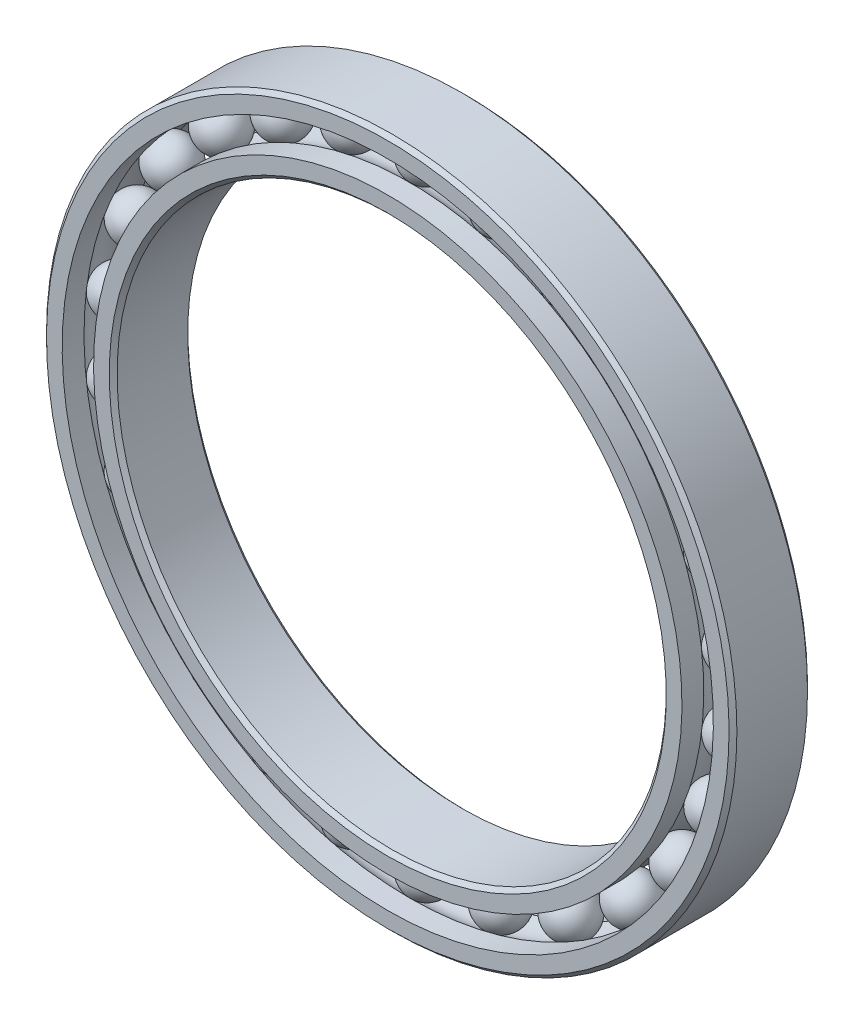
ISO-10303-21;
HEADER;
FILE_DESCRIPTION(('STEP AP214'),'2;1');
FILE_NAME('part.step','',(''),(''),'','','');
FILE_SCHEMA(('AUTOMOTIVE_DESIGN { 1 0 10303 214 1 1 1 1 }'));
ENDSEC;
DATA;
#1=APPLICATION_CONTEXT('core data for automotive mechanical design processes');
#2=APPLICATION_PROTOCOL_DEFINITION('international standard','automotive_design',2000,#1);
#3=PRODUCT_CONTEXT('',#1,'mechanical');
#4=PRODUCT('Part','Part','',(#3));
#5=PRODUCT_RELATED_PRODUCT_CATEGORY('part','',(#4));
#6=PRODUCT_DEFINITION_FORMATION('','',#4);
#7=PRODUCT_DEFINITION_CONTEXT('part definition',#1,'design');
#8=PRODUCT_DEFINITION('design','',#6,#7);
#9=PRODUCT_DEFINITION_SHAPE('','',#8);
#10=(LENGTH_UNIT() NAMED_UNIT(*) SI_UNIT(.MILLI.,.METRE.));
#11=(NAMED_UNIT(*) PLANE_ANGLE_UNIT() SI_UNIT($,.RADIAN.));
#12=(NAMED_UNIT(*) SI_UNIT($,.STERADIAN.) SOLID_ANGLE_UNIT());
#13=UNCERTAINTY_MEASURE_WITH_UNIT(LENGTH_MEASURE(1.E-05),#10,'distance_accuracy_value','');
#14=(GEOMETRIC_REPRESENTATION_CONTEXT(3) GLOBAL_UNCERTAINTY_ASSIGNED_CONTEXT((#13)) GLOBAL_UNIT_ASSIGNED_CONTEXT((#10,
#11,#12)) REPRESENTATION_CONTEXT('',''));
#15=CARTESIAN_POINT('',(0.,0.,0.));
#16=DIRECTION('',(0.,0.,1.));
#17=DIRECTION('',(1.,0.,0.));
#18=AXIS2_PLACEMENT_3D('',#15,#16,#17);
#19=CARTESIAN_POINT('',(4.72648436967901,19.1761008941646,0.));
#20=DIRECTION('',(0.,0.,1.));
#21=DIRECTION('',(0.239315664287545,0.970941817426055,0.));
#22=AXIS2_PLACEMENT_3D('',#19,#20,#21);
#23=SPHERICAL_SURFACE('',#22,1.49484711634152);
#24=CARTESIAN_POINT('',(4.72648436967901,19.1761008941646,1.49484711634152));
#25=VERTEX_POINT('',#24);
#26=VERTEX_LOOP('',#25);
#27=FACE_BOUND('',#26,.T.);
#28=ADVANCED_FACE('F51',(#27),#23,.T.);
#29=CLOSED_SHELL('',(#28));
#30=MANIFOLD_SOLID_BREP('B2',#29);
#31=CARTESIAN_POINT('',(9.17828264786421,17.487756506651,0.));
#32=DIRECTION('',(0.,0.,1.));
#33=DIRECTION('',(0.464723172043757,0.885456025653216,0.));
#34=AXIS2_PLACEMENT_3D('',#31,#32,#33);
#35=SPHERICAL_SURFACE('',#34,1.49484711634152);
#36=CARTESIAN_POINT('',(9.17828264786421,17.487756506651,1.49484711634152));
#37=VERTEX_POINT('',#36);
#38=VERTEX_LOOP('',#37);
#39=FACE_BOUND('',#38,.T.);
#40=ADVANCED_FACE('F73',(#39),#35,.T.);
#41=CLOSED_SHELL('',(#40));
#42=MANIFOLD_SOLID_BREP('B6',#41);
#43=CARTESIAN_POINT('',(13.0966725002555,14.7830872763794,0.));
#44=DIRECTION('',(0.,0.,1.));
#45=DIRECTION('',(0.663122658240786,0.748510748171109,0.));
#46=AXIS2_PLACEMENT_3D('',#43,#44,#45);
#47=SPHERICAL_SURFACE('',#46,1.49484711634152);
#48=CARTESIAN_POINT('',(13.0966725002555,14.7830872763794,1.49484711634152));
#49=VERTEX_POINT('',#48);
#50=VERTEX_LOOP('',#49);
#51=FACE_BOUND('',#50,.T.);
#52=ADVANCED_FACE('F95',(#51),#47,.T.);
#53=CLOSED_SHELL('',(#52));
#54=MANIFOLD_SOLID_BREP('B47',#53);
#55=CARTESIAN_POINT('',(16.2539313513996,11.2192787479405,0.));
#56=DIRECTION('',(0.,0.,1.));
#57=DIRECTION('',(0.822983865893649,0.568064746731166,0.));
#58=AXIS2_PLACEMENT_3D('',#55,#56,#57);
#59=SPHERICAL_SURFACE('',#58,1.49484711634152);
#60=CARTESIAN_POINT('',(16.2539313513996,11.2192787479405,1.49484711634152));
#61=VERTEX_POINT('',#60);
#62=VERTEX_LOOP('',#61);
#63=FACE_BOUND('',#62,.T.);
#64=ADVANCED_FACE('F117',(#63),#59,.T.);
#65=CLOSED_SHELL('',(#64));
#66=MANIFOLD_SOLID_BREP('B69',#65);
#67=CARTESIAN_POINT('',(18.4665707930369,7.00344651909029,0.));
#68=DIRECTION('',(0.,0.,1.));
#69=DIRECTION('',(0.935016242685411,0.354604887042546,0.));
#70=AXIS2_PLACEMENT_3D('',#67,#68,#69);
#71=SPHERICAL_SURFACE('',#70,1.49484711634152);
#72=CARTESIAN_POINT('',(18.4665707930369,7.00344651909029,1.49484711634152));
#73=VERTEX_POINT('',#72);
#74=VERTEX_LOOP('',#73);
#75=FACE_BOUND('',#74,.T.);
#76=ADVANCED_FACE('F139',(#75),#71,.T.);
#77=CLOSED_SHELL('',(#76));
#78=MANIFOLD_SOLID_BREP('B91',#77);
#79=CARTESIAN_POINT('',(19.6060002634365,2.38059943504284,0.));
#80=DIRECTION('',(0.,0.,1.));
#81=DIRECTION('',(0.992708874098053,0.120536680255334,0.));
#82=AXIS2_PLACEMENT_3D('',#79,#80,#81);
#83=SPHERICAL_SURFACE('',#82,1.49484711634152);
#84=CARTESIAN_POINT('',(19.6060002634365,2.38059943504284,1.49484711634152));
#85=VERTEX_POINT('',#84);
#86=VERTEX_LOOP('',#85);
#87=FACE_BOUND('',#86,.T.);
#88=ADVANCED_FACE('F161',(#87),#83,.T.);
#89=CLOSED_SHELL('',(#88));
#90=MANIFOLD_SOLID_BREP('B113',#89);
#91=CARTESIAN_POINT('',(19.6060002634366,-2.38059943504243,0.));
#92=DIRECTION('',(0.,0.,1.));
#93=DIRECTION('',(0.992708874098055,-0.120536680255313,0.));
#94=AXIS2_PLACEMENT_3D('',#91,#92,#93);
#95=SPHERICAL_SURFACE('',#94,1.49484711634152);
#96=CARTESIAN_POINT('',(19.6060002634366,-2.38059943504243,1.49484711634152));
#97=VERTEX_POINT('',#96);
#98=VERTEX_LOOP('',#97);
#99=FACE_BOUND('',#98,.T.);
#100=ADVANCED_FACE('F183',(#99),#95,.T.);
#101=CLOSED_SHELL('',(#100));
#102=MANIFOLD_SOLID_BREP('B135',#101);
#103=CARTESIAN_POINT('',(18.466570793037,-7.00344651908991,0.));
#104=DIRECTION('',(0.,0.,1.));
#105=DIRECTION('',(0.935016242685418,-0.354604887042527,0.));
#106=AXIS2_PLACEMENT_3D('',#103,#104,#105);
#107=SPHERICAL_SURFACE('',#106,1.49484711634152);
#108=CARTESIAN_POINT('',(18.466570793037,-7.00344651908991,1.49484711634152));
#109=VERTEX_POINT('',#108);
#110=VERTEX_LOOP('',#109);
#111=FACE_BOUND('',#110,.T.);
#112=ADVANCED_FACE('F205',(#111),#107,.T.);
#113=CLOSED_SHELL('',(#112));
#114=MANIFOLD_SOLID_BREP('B157',#113);
#115=CARTESIAN_POINT('',(16.2539313513998,-11.2192787479402,0.));
#116=DIRECTION('',(0.,0.,1.));
#117=DIRECTION('',(0.822983865893661,-0.568064746731149,0.));
#118=AXIS2_PLACEMENT_3D('',#115,#116,#117);
#119=SPHERICAL_SURFACE('',#118,1.49484711634152);
#120=CARTESIAN_POINT('',(16.2539313513998,-11.2192787479402,1.49484711634151));
#121=VERTEX_POINT('',#120);
#122=VERTEX_LOOP('',#121);
#123=FACE_BOUND('',#122,.T.);
#124=ADVANCED_FACE('F227',(#123),#119,.T.);
#125=CLOSED_SHELL('',(#124));
#126=MANIFOLD_SOLID_BREP('B179',#125);
#127=CARTESIAN_POINT('',(13.0966725002558,-14.7830872763791,0.));
#128=DIRECTION('',(0.,0.,1.));
#129=DIRECTION('',(0.663122658240802,-0.748510748171095,0.));
#130=AXIS2_PLACEMENT_3D('',#127,#128,#129);
#131=SPHERICAL_SURFACE('',#130,1.49484711634152);
#132=CARTESIAN_POINT('',(13.0966725002558,-14.7830872763791,1.49484711634151));
#133=VERTEX_POINT('',#132);
#134=VERTEX_LOOP('',#133);
#135=FACE_BOUND('',#134,.T.);
#136=ADVANCED_FACE('F249',(#135),#131,.T.);
#137=CLOSED_SHELL('',(#136));
#138=MANIFOLD_SOLID_BREP('B201',#137);
#139=CARTESIAN_POINT('',(9.17828264786457,-17.4877565066508,0.));
#140=DIRECTION('',(0.,0.,1.));
#141=DIRECTION('',(0.464723172043776,-0.885456025653206,0.));
#142=AXIS2_PLACEMENT_3D('',#139,#140,#141);
#143=SPHERICAL_SURFACE('',#142,1.49484711634152);
#144=CARTESIAN_POINT('',(9.17828264786457,-17.4877565066508,1.49484711634151));
#145=VERTEX_POINT('',#144);
#146=VERTEX_LOOP('',#145);
#147=FACE_BOUND('',#146,.T.);
#148=ADVANCED_FACE('F271',(#147),#143,.T.);
#149=CLOSED_SHELL('',(#148));
#150=MANIFOLD_SOLID_BREP('B223',#149);
#151=CARTESIAN_POINT('',(4.72648436967941,-19.1761008941645,0.));
#152=DIRECTION('',(0.,0.,1.));
#153=DIRECTION('',(0.239315664287565,-0.97094181742605,0.));
#154=AXIS2_PLACEMENT_3D('',#151,#152,#153);
#155=SPHERICAL_SURFACE('',#154,1.49484711634152);
#156=CARTESIAN_POINT('',(4.72648436967941,-19.1761008941645,1.49484711634151));
#157=VERTEX_POINT('',#156);
#158=VERTEX_LOOP('',#157);
#159=FACE_BOUND('',#158,.T.);
#160=ADVANCED_FACE('F293',(#159),#155,.T.);
#161=CLOSED_SHELL('',(#160));
#162=MANIFOLD_SOLID_BREP('B245',#161);
#163=CARTESIAN_POINT('',(0.,-19.75,0.));
#164=DIRECTION('',(0.,0.,1.));
#165=DIRECTION('',(0.,-1.,0.));
#166=AXIS2_PLACEMENT_3D('',#163,#164,#165);
#167=SPHERICAL_SURFACE('',#166,1.49484711634152);
#168=CARTESIAN_POINT('',(0.,-19.75,1.49484711634151));
#169=VERTEX_POINT('',#168);
#170=VERTEX_LOOP('',#169);
#171=FACE_BOUND('',#170,.T.);
#172=ADVANCED_FACE('F315',(#171),#167,.T.);
#173=CLOSED_SHELL('',(#172));
#174=MANIFOLD_SOLID_BREP('B267',#173);
#175=CARTESIAN_POINT('',(-4.72648436967915,-19.1761008941646,0.));
#176=DIRECTION('',(0.,0.,1.));
#177=DIRECTION('',(-0.239315664287552,-0.970941817426054,0.));
#178=AXIS2_PLACEMENT_3D('',#175,#176,#177);
#179=SPHERICAL_SURFACE('',#178,1.49484711634152);
#180=CARTESIAN_POINT('',(-4.72648436967915,-19.1761008941646,1.49484711634151));
#181=VERTEX_POINT('',#180);
#182=VERTEX_LOOP('',#181);
#183=FACE_BOUND('',#182,.T.);
#184=ADVANCED_FACE('F337',(#183),#179,.T.);
#185=CLOSED_SHELL('',(#184));
#186=MANIFOLD_SOLID_BREP('B289',#185);
#187=CARTESIAN_POINT('',(-9.17828264786432,-17.487756506651,0.));
#188=DIRECTION('',(0.,0.,1.));
#189=DIRECTION('',(-0.464723172043763,-0.885456025653213,0.));
#190=AXIS2_PLACEMENT_3D('',#187,#188,#189);
#191=SPHERICAL_SURFACE('',#190,1.49484711634152);
#192=CARTESIAN_POINT('',(-9.17828264786432,-17.487756506651,1.49484711634151));
#193=VERTEX_POINT('',#192);
#194=VERTEX_LOOP('',#193);
#195=FACE_BOUND('',#194,.T.);
#196=ADVANCED_FACE('F359',(#195),#191,.T.);
#197=CLOSED_SHELL('',(#196));
#198=MANIFOLD_SOLID_BREP('B311',#197);
#199=CARTESIAN_POINT('',(-13.0966725002556,-14.7830872763793,0.));
#200=DIRECTION('',(0.,0.,1.));
#201=DIRECTION('',(-0.663122658240791,-0.748510748171105,0.));
#202=AXIS2_PLACEMENT_3D('',#199,#200,#201);
#203=SPHERICAL_SURFACE('',#202,1.49484711634152);
#204=CARTESIAN_POINT('',(-13.0966725002556,-14.7830872763793,1.49484711634151));
#205=VERTEX_POINT('',#204);
#206=VERTEX_LOOP('',#205);
#207=FACE_BOUND('',#206,.T.);
#208=ADVANCED_FACE('F381',(#207),#203,.T.);
#209=CLOSED_SHELL('',(#208));
#210=MANIFOLD_SOLID_BREP('B333',#209);
#211=CARTESIAN_POINT('',(-16.2539313513997,-11.2192787479404,0.));
#212=DIRECTION('',(0.,0.,1.));
#213=DIRECTION('',(-0.822983865893654,-0.56806474673116,0.));
#214=AXIS2_PLACEMENT_3D('',#211,#212,#213);
#215=SPHERICAL_SURFACE('',#214,1.49484711634152);
#216=CARTESIAN_POINT('',(-16.2539313513997,-11.2192787479404,1.49484711634151));
#217=VERTEX_POINT('',#216);
#218=VERTEX_LOOP('',#217);
#219=FACE_BOUND('',#218,.T.);
#220=ADVANCED_FACE('F403',(#219),#215,.T.);
#221=CLOSED_SHELL('',(#220));
#222=MANIFOLD_SOLID_BREP('B355',#221);
#223=CARTESIAN_POINT('',(-18.4665707930369,-7.00344651909016,0.));
#224=DIRECTION('',(0.,0.,1.));
#225=DIRECTION('',(-0.935016242685413,-0.35460488704254,0.));
#226=AXIS2_PLACEMENT_3D('',#223,#224,#225);
#227=SPHERICAL_SURFACE('',#226,1.49484711634152);
#228=CARTESIAN_POINT('',(-18.4665707930369,-7.00344651909016,1.49484711634152));
#229=VERTEX_POINT('',#228);
#230=VERTEX_LOOP('',#229);
#231=FACE_BOUND('',#230,.T.);
#232=ADVANCED_FACE('F425',(#231),#227,.T.);
#233=CLOSED_SHELL('',(#232));
#234=MANIFOLD_SOLID_BREP('B377',#233);
#235=CARTESIAN_POINT('',(-19.6060002634366,-2.38059943504271,0.));
#236=DIRECTION('',(0.,0.,1.));
#237=DIRECTION('',(-0.992708874098054,-0.120536680255327,0.));
#238=AXIS2_PLACEMENT_3D('',#235,#236,#237);
#239=SPHERICAL_SURFACE('',#238,1.49484711634152);
#240=CARTESIAN_POINT('',(-19.6060002634366,-2.38059943504271,1.49484711634152));
#241=VERTEX_POINT('',#240);
#242=VERTEX_LOOP('',#241);
#243=FACE_BOUND('',#242,.T.);
#244=ADVANCED_FACE('F447',(#243),#239,.T.);
#245=CLOSED_SHELL('',(#244));
#246=MANIFOLD_SOLID_BREP('B399',#245);
#247=CARTESIAN_POINT('',(-19.6060002634366,2.38059943504257,0.));
#248=DIRECTION('',(0.,0.,1.));
#249=DIRECTION('',(-0.992708874098054,0.12053668025532,0.));
#250=AXIS2_PLACEMENT_3D('',#247,#248,#249);
#251=SPHERICAL_SURFACE('',#250,1.49484711634152);
#252=CARTESIAN_POINT('',(-19.6060002634366,2.38059943504257,1.49484711634152));
#253=VERTEX_POINT('',#252);
#254=VERTEX_LOOP('',#253);
#255=FACE_BOUND('',#254,.T.);
#256=ADVANCED_FACE('F469',(#255),#251,.T.);
#257=CLOSED_SHELL('',(#256));
#258=MANIFOLD_SOLID_BREP('B421',#257);
#259=CARTESIAN_POINT('',(-18.466570793037,7.00344651909003,0.));
#260=DIRECTION('',(0.,0.,1.));
#261=DIRECTION('',(-0.935016242685416,0.354604887042533,0.));
#262=AXIS2_PLACEMENT_3D('',#259,#260,#261);
#263=SPHERICAL_SURFACE('',#262,1.49484711634152);
#264=CARTESIAN_POINT('',(-18.466570793037,7.00344651909003,1.49484711634152));
#265=VERTEX_POINT('',#264);
#266=VERTEX_LOOP('',#265);
#267=FACE_BOUND('',#266,.T.);
#268=ADVANCED_FACE('F491',(#267),#263,.T.);
#269=CLOSED_SHELL('',(#268));
#270=MANIFOLD_SOLID_BREP('B443',#269);
#271=CARTESIAN_POINT('',(-16.2539313513997,11.2192787479403,0.));
#272=DIRECTION('',(0.,0.,1.));
#273=DIRECTION('',(-0.822983865893658,0.568064746731154,0.));
#274=AXIS2_PLACEMENT_3D('',#271,#272,#273);
#275=SPHERICAL_SURFACE('',#274,1.49484711634152);
#276=CARTESIAN_POINT('',(-16.2539313513997,11.2192787479403,1.49484711634152));
#277=VERTEX_POINT('',#276);
#278=VERTEX_LOOP('',#277);
#279=FACE_BOUND('',#278,.T.);
#280=ADVANCED_FACE('F513',(#279),#275,.T.);
#281=CLOSED_SHELL('',(#280));
#282=MANIFOLD_SOLID_BREP('B465',#281);
#283=CARTESIAN_POINT('',(-13.0966725002557,14.7830872763792,0.));
#284=DIRECTION('',(0.,0.,1.));
#285=DIRECTION('',(-0.663122658240796,0.7485107481711,0.));
#286=AXIS2_PLACEMENT_3D('',#283,#284,#285);
#287=SPHERICAL_SURFACE('',#286,1.49484711634152);
#288=CARTESIAN_POINT('',(-13.0966725002557,14.7830872763792,1.49484711634152));
#289=VERTEX_POINT('',#288);
#290=VERTEX_LOOP('',#289);
#291=FACE_BOUND('',#290,.T.);
#292=ADVANCED_FACE('F535',(#291),#287,.T.);
#293=CLOSED_SHELL('',(#292));
#294=MANIFOLD_SOLID_BREP('B487',#293);
#295=CARTESIAN_POINT('',(-9.17828264786445,17.4877565066509,0.));
#296=DIRECTION('',(0.,0.,1.));
#297=DIRECTION('',(-0.46472317204377,0.885456025653209,0.));
#298=AXIS2_PLACEMENT_3D('',#295,#296,#297);
#299=SPHERICAL_SURFACE('',#298,1.49484711634152);
#300=CARTESIAN_POINT('',(-9.17828264786445,17.4877565066509,1.49484711634152));
#301=VERTEX_POINT('',#300);
#302=VERTEX_LOOP('',#301);
#303=FACE_BOUND('',#302,.T.);
#304=ADVANCED_FACE('F557',(#303),#299,.T.);
#305=CLOSED_SHELL('',(#304));
#306=MANIFOLD_SOLID_BREP('B509',#305);
#307=CARTESIAN_POINT('',(-4.72648436967928,19.1761008941645,0.));
#308=DIRECTION('',(0.,0.,1.));
#309=DIRECTION('',(-0.239315664287558,0.970941817426052,0.));
#310=AXIS2_PLACEMENT_3D('',#307,#308,#309);
#311=SPHERICAL_SURFACE('',#310,1.49484711634152);
#312=CARTESIAN_POINT('',(-4.72648436967928,19.1761008941645,1.49484711634152));
#313=VERTEX_POINT('',#312);
#314=VERTEX_LOOP('',#313);
#315=FACE_BOUND('',#314,.T.);
#316=ADVANCED_FACE('F579',(#315),#311,.T.);
#317=CLOSED_SHELL('',(#316));
#318=MANIFOLD_SOLID_BREP('B531',#317);
#319=CARTESIAN_POINT('',(0.,19.75,0.));
#320=DIRECTION('',(0.,0.,1.));
#321=DIRECTION('',(0.,1.,0.));
#322=AXIS2_PLACEMENT_3D('',#319,#320,#321);
#323=SPHERICAL_SURFACE('',#322,1.49484711634152);
#324=CARTESIAN_POINT('',(0.,19.75,1.49484711634152));
#325=VERTEX_POINT('',#324);
#326=VERTEX_LOOP('',#325);
#327=FACE_BOUND('',#326,.T.);
#328=ADVANCED_FACE('F603',(#327),#323,.T.);
#329=CLOSED_SHELL('',(#328));
#330=MANIFOLD_SOLID_BREP('B553',#329);
#331=CARTESIAN_POINT('',(0.,18.75,2.5));
#332=DIRECTION('',(0.,0.,-1.));
#333=DIRECTION('',(0.,1.,0.));
#334=AXIS2_PLACEMENT_3D('',#331,#332,#333);
#335=PLANE('',#334);
#336=CARTESIAN_POINT('',(0.,0.,2.5));
#337=DIRECTION('',(0.,0.,1.));
#338=DIRECTION('',(0.,-1.,0.));
#339=AXIS2_PLACEMENT_3D('',#336,#337,#338);
#340=CIRCLE('',#339,17.75);
#341=CARTESIAN_POINT('',(0.,-17.75,2.5));
#342=VERTEX_POINT('',#341);
#343=EDGE_CURVE('E663',#342,#342,#340,.T.);
#344=ORIENTED_EDGE('',*,*,#343,.F.);
#345=EDGE_LOOP('',(#344));
#346=FACE_BOUND('',#345,.T.);
#347=CARTESIAN_POINT('',(0.,0.,2.5));
#348=DIRECTION('',(0.,0.,1.));
#349=DIRECTION('',(0.,-1.,0.));
#350=AXIS2_PLACEMENT_3D('',#347,#348,#349);
#351=CIRCLE('',#350,18.75);
#352=CARTESIAN_POINT('',(0.,-18.75,2.5));
#353=VERTEX_POINT('',#352);
#354=EDGE_CURVE('E602',#353,#353,#351,.T.);
#355=ORIENTED_EDGE('',*,*,#354,.T.);
#356=EDGE_LOOP('',(#355));
#357=FACE_BOUND('',#356,.T.);
#358=ADVANCED_FACE('F626',(#346,#357),#335,.F.);
#359=CARTESIAN_POINT('',(0.,0.,2.49999999999999));
#360=DIRECTION('',(0.,0.,1.));
#361=DIRECTION('',(0.,-1.,0.));
#362=AXIS2_PLACEMENT_3D('',#359,#360,#361);
#363=CYLINDRICAL_SURFACE('',#362,18.75);
#364=ORIENTED_EDGE('',*,*,#354,.F.);
#365=EDGE_LOOP('',(#364));
#366=FACE_BOUND('',#365,.T.);
#367=CARTESIAN_POINT('',(0.,0.,1.1111111111111));
#368=DIRECTION('',(0.,0.,1.));
#369=DIRECTION('',(0.,-1.,0.));
#370=AXIS2_PLACEMENT_3D('',#367,#368,#369);
#371=CIRCLE('',#370,18.75);
#372=CARTESIAN_POINT('',(0.,-18.75,1.1111111111111));
#373=VERTEX_POINT('',#372);
#374=EDGE_CURVE('E633',#373,#373,#371,.T.);
#375=ORIENTED_EDGE('',*,*,#374,.T.);
#376=EDGE_LOOP('',(#375));
#377=FACE_BOUND('',#376,.T.);
#378=ADVANCED_FACE('F672',(#366,#377),#363,.T.);
#379=CARTESIAN_POINT('',(0.,0.,0.));
#380=DIRECTION('',(0.,0.,1.));
#381=DIRECTION('',(0.,-1.,0.));
#382=AXIS2_PLACEMENT_3D('',#379,#380,#381);
#383=TOROIDAL_SURFACE('',#382,19.75,1.49484711634152);
#384=ORIENTED_EDGE('',*,*,#374,.F.);
#385=EDGE_LOOP('',(#384));
#386=FACE_BOUND('',#385,.T.);
#387=CARTESIAN_POINT('',(0.,0.,-1.11111111111111));
#388=DIRECTION('',(0.,0.,1.));
#389=DIRECTION('',(0.,-1.,0.));
#390=AXIS2_PLACEMENT_3D('',#387,#388,#389);
#391=CIRCLE('',#390,18.75);
#392=CARTESIAN_POINT('',(0.,-18.75,-1.11111111111111));
#393=VERTEX_POINT('',#392);
#394=EDGE_CURVE('E639',#393,#393,#391,.T.);
#395=ORIENTED_EDGE('',*,*,#394,.T.);
#396=EDGE_LOOP('',(#395));
#397=FACE_BOUND('',#396,.T.);
#398=ADVANCED_FACE('F676',(#386,#397),#383,.F.);
#399=CARTESIAN_POINT('',(0.,0.,2.49999999999999));
#400=DIRECTION('',(0.,0.,1.));
#401=DIRECTION('',(0.,-1.,0.));
#402=AXIS2_PLACEMENT_3D('',#399,#400,#401);
#403=CYLINDRICAL_SURFACE('',#402,18.75);
#404=ORIENTED_EDGE('',*,*,#394,.F.);
#405=EDGE_LOOP('',(#404));
#406=FACE_BOUND('',#405,.T.);
#407=CARTESIAN_POINT('',(0.,0.,-2.50000000000001));
#408=DIRECTION('',(0.,0.,1.));
#409=DIRECTION('',(0.,-1.,0.));
#410=AXIS2_PLACEMENT_3D('',#407,#408,#409);
#411=CIRCLE('',#410,18.75);
#412=CARTESIAN_POINT('',(0.,-18.75,-2.50000000000001));
#413=VERTEX_POINT('',#412);
#414=EDGE_CURVE('E645',#413,#413,#411,.T.);
#415=ORIENTED_EDGE('',*,*,#414,.T.);
#416=EDGE_LOOP('',(#415));
#417=FACE_BOUND('',#416,.T.);
#418=ADVANCED_FACE('F681',(#406,#417),#403,.T.);
#419=CARTESIAN_POINT('',(0.,17.75,-2.50000000000001));
#420=DIRECTION('',(0.,0.,1.));
#421=DIRECTION('',(0.,-1.,0.));
#422=AXIS2_PLACEMENT_3D('',#419,#420,#421);
#423=PLANE('',#422);
#424=ORIENTED_EDGE('',*,*,#414,.F.);
#425=EDGE_LOOP('',(#424));
#426=FACE_BOUND('',#425,.T.);
#427=CARTESIAN_POINT('',(0.,0.,-2.50000000000001));
#428=DIRECTION('',(0.,0.,1.));
#429=DIRECTION('',(0.,-1.,0.));
#430=AXIS2_PLACEMENT_3D('',#427,#428,#429);
#431=CIRCLE('',#430,17.75);
#432=CARTESIAN_POINT('',(0.,-17.75,-2.50000000000001));
#433=VERTEX_POINT('',#432);
#434=EDGE_CURVE('E651',#433,#433,#431,.T.);
#435=ORIENTED_EDGE('',*,*,#434,.T.);
#436=EDGE_LOOP('',(#435));
#437=FACE_BOUND('',#436,.T.);
#438=ADVANCED_FACE('F687',(#426,#437),#423,.F.);
#439=CARTESIAN_POINT('',(0.,0.,-2.25000000000001));
#440=DIRECTION('',(0.,0.,-1.));
#441=DIRECTION('',(0.,1.,0.));
#442=AXIS2_PLACEMENT_3D('',#439,#440,#441);
#443=CONICAL_SURFACE('',#442,17.5,0.785398163397405);
#444=ORIENTED_EDGE('',*,*,#434,.F.);
#445=EDGE_LOOP('',(#444));
#446=FACE_BOUND('',#445,.T.);
#447=CARTESIAN_POINT('',(0.,0.,-2.25000000000001));
#448=DIRECTION('',(0.,0.,1.));
#449=DIRECTION('',(0.,-1.,0.));
#450=AXIS2_PLACEMENT_3D('',#447,#448,#449);
#451=CIRCLE('',#450,17.5);
#452=CARTESIAN_POINT('',(0.,-17.5,-2.25000000000001));
#453=VERTEX_POINT('',#452);
#454=EDGE_CURVE('E655',#453,#453,#451,.T.);
#455=ORIENTED_EDGE('',*,*,#454,.T.);
#456=EDGE_LOOP('',(#455));
#457=FACE_BOUND('',#456,.T.);
#458=ADVANCED_FACE('F691',(#446,#457),#443,.F.);
#459=CARTESIAN_POINT('',(0.,0.,2.49999999999999));
#460=DIRECTION('',(0.,0.,1.));
#461=DIRECTION('',(0.,-1.,0.));
#462=AXIS2_PLACEMENT_3D('',#459,#460,#461);
#463=CYLINDRICAL_SURFACE('',#462,17.5);
#464=ORIENTED_EDGE('',*,*,#454,.F.);
#465=EDGE_LOOP('',(#464));
#466=FACE_BOUND('',#465,.T.);
#467=CARTESIAN_POINT('',(0.,0.,2.25000000000002));
#468=DIRECTION('',(0.,0.,1.));
#469=DIRECTION('',(0.,-1.,0.));
#470=AXIS2_PLACEMENT_3D('',#467,#468,#469);
#471=CIRCLE('',#470,17.5);
#472=CARTESIAN_POINT('',(0.,-17.5,2.25000000000002));
#473=VERTEX_POINT('',#472);
#474=EDGE_CURVE('E659',#473,#473,#471,.T.);
#475=ORIENTED_EDGE('',*,*,#474,.T.);
#476=EDGE_LOOP('',(#475));
#477=FACE_BOUND('',#476,.T.);
#478=ADVANCED_FACE('F695',(#466,#477),#463,.F.);
#479=CARTESIAN_POINT('',(0.,0.,2.5));
#480=DIRECTION('',(0.,0.,1.));
#481=DIRECTION('',(0.,-1.,0.));
#482=AXIS2_PLACEMENT_3D('',#479,#480,#481);
#483=CONICAL_SURFACE('',#482,17.75,0.785398163397488);
#484=ORIENTED_EDGE('',*,*,#474,.F.);
#485=EDGE_LOOP('',(#484));
#486=FACE_BOUND('',#485,.T.);
#487=ORIENTED_EDGE('',*,*,#343,.T.);
#488=EDGE_LOOP('',(#487));
#489=FACE_BOUND('',#488,.T.);
#490=ADVANCED_FACE('F669',(#486,#489),#483,.F.);
#491=CLOSED_SHELL('',(#358,#378,#398,#418,#438,#458,#478,#490));
#492=MANIFOLD_SOLID_BREP('B575',#491);
#493=CARTESIAN_POINT('',(0.,0.,2.49999999999999));
#494=DIRECTION('',(0.,0.,1.));
#495=DIRECTION('',(0.,-1.,0.));
#496=AXIS2_PLACEMENT_3D('',#493,#494,#495);
#497=CYLINDRICAL_SURFACE('',#496,22.);
#498=CARTESIAN_POINT('',(0.,0.,2.25));
#499=DIRECTION('',(0.,0.,1.));
#500=DIRECTION('',(0.,-1.,0.));
#501=AXIS2_PLACEMENT_3D('',#498,#499,#500);
#502=CIRCLE('',#501,22.);
#503=CARTESIAN_POINT('',(0.,-22.,2.25));
#504=VERTEX_POINT('',#503);
#505=EDGE_CURVE('E625',#504,#504,#502,.T.);
#506=ORIENTED_EDGE('',*,*,#505,.F.);
#507=EDGE_LOOP('',(#506));
#508=FACE_BOUND('',#507,.T.);
#509=CARTESIAN_POINT('',(0.,0.,-2.25000000000001));
#510=DIRECTION('',(0.,0.,1.));
#511=DIRECTION('',(0.,-1.,0.));
#512=AXIS2_PLACEMENT_3D('',#509,#510,#511);
#513=CIRCLE('',#512,22.);
#514=CARTESIAN_POINT('',(0.,-22.,-2.25000000000002));
#515=VERTEX_POINT('',#514);
#516=EDGE_CURVE('E832',#515,#515,#513,.T.);
#517=ORIENTED_EDGE('',*,*,#516,.T.);
#518=EDGE_LOOP('',(#517));
#519=FACE_BOUND('',#518,.T.);
#520=ADVANCED_FACE('F795',(#508,#519),#497,.T.);
#521=CARTESIAN_POINT('',(0.,0.,2.25));
#522=DIRECTION('',(0.,0.,-1.));
#523=DIRECTION('',(0.,1.,0.));
#524=AXIS2_PLACEMENT_3D('',#521,#522,#523);
#525=CONICAL_SURFACE('',#524,22.,0.785398163397431);
#526=CARTESIAN_POINT('',(0.,0.,2.49999999999999));
#527=DIRECTION('',(0.,0.,1.));
#528=DIRECTION('',(0.,-1.,0.));
#529=AXIS2_PLACEMENT_3D('',#526,#527,#528);
#530=CIRCLE('',#529,21.75);
#531=CARTESIAN_POINT('',(0.,-21.75,2.49999999999999));
#532=VERTEX_POINT('',#531);
#533=EDGE_CURVE('E802',#532,#532,#530,.T.);
#534=ORIENTED_EDGE('',*,*,#533,.F.);
#535=EDGE_LOOP('',(#534));
#536=FACE_BOUND('',#535,.T.);
#537=ORIENTED_EDGE('',*,*,#505,.T.);
#538=EDGE_LOOP('',(#537));
#539=FACE_BOUND('',#538,.T.);
#540=ADVANCED_FACE('F871',(#536,#539),#525,.T.);
#541=CARTESIAN_POINT('',(0.,21.75,2.49999999999999));
#542=DIRECTION('',(0.,0.,-1.));
#543=DIRECTION('',(0.,1.,0.));
#544=AXIS2_PLACEMENT_3D('',#541,#542,#543);
#545=PLANE('',#544);
#546=CARTESIAN_POINT('',(0.,0.,2.49999999999999));
#547=DIRECTION('',(0.,0.,1.));
#548=DIRECTION('',(0.,-1.,0.));
#549=AXIS2_PLACEMENT_3D('',#546,#547,#548);
#550=CIRCLE('',#549,20.75);
#551=CARTESIAN_POINT('',(0.,-20.75,2.49999999999999));
#552=VERTEX_POINT('',#551);
#553=EDGE_CURVE('E808',#552,#552,#550,.T.);
#554=ORIENTED_EDGE('',*,*,#553,.F.);
#555=EDGE_LOOP('',(#554));
#556=FACE_BOUND('',#555,.T.);
#557=ORIENTED_EDGE('',*,*,#533,.T.);
#558=EDGE_LOOP('',(#557));
#559=FACE_BOUND('',#558,.T.);
#560=ADVANCED_FACE('F866',(#556,#559),#545,.F.);
#561=CARTESIAN_POINT('',(0.,0.,2.49999999999999));
#562=DIRECTION('',(0.,0.,1.));
#563=DIRECTION('',(0.,-1.,0.));
#564=AXIS2_PLACEMENT_3D('',#561,#562,#563);
#565=CYLINDRICAL_SURFACE('',#564,20.75);
#566=CARTESIAN_POINT('',(0.,0.,1.1111111111111));
#567=DIRECTION('',(0.,0.,1.));
#568=DIRECTION('',(0.,-1.,0.));
#569=AXIS2_PLACEMENT_3D('',#566,#567,#568);
#570=CIRCLE('',#569,20.75);
#571=CARTESIAN_POINT('',(0.,-20.75,1.1111111111111));
#572=VERTEX_POINT('',#571);
#573=EDGE_CURVE('E814',#572,#572,#570,.T.);
#574=ORIENTED_EDGE('',*,*,#573,.F.);
#575=EDGE_LOOP('',(#574));
#576=FACE_BOUND('',#575,.T.);
#577=ORIENTED_EDGE('',*,*,#553,.T.);
#578=EDGE_LOOP('',(#577));
#579=FACE_BOUND('',#578,.T.);
#580=ADVANCED_FACE('F860',(#576,#579),#565,.F.);
#581=CARTESIAN_POINT('',(0.,0.,0.));
#582=DIRECTION('',(0.,0.,1.));
#583=DIRECTION('',(0.,-1.,0.));
#584=AXIS2_PLACEMENT_3D('',#581,#582,#583);
#585=TOROIDAL_SURFACE('',#584,19.75,1.49484711634152);
#586=CARTESIAN_POINT('',(0.,0.,-1.11111111111112));
#587=DIRECTION('',(0.,0.,1.));
#588=DIRECTION('',(0.,-1.,0.));
#589=AXIS2_PLACEMENT_3D('',#586,#587,#588);
#590=CIRCLE('',#589,20.75);
#591=CARTESIAN_POINT('',(0.,-20.75,-1.11111111111112));
#592=VERTEX_POINT('',#591);
#593=EDGE_CURVE('E820',#592,#592,#590,.T.);
#594=ORIENTED_EDGE('',*,*,#593,.F.);
#595=EDGE_LOOP('',(#594));
#596=FACE_BOUND('',#595,.T.);
#597=ORIENTED_EDGE('',*,*,#573,.T.);
#598=EDGE_LOOP('',(#597));
#599=FACE_BOUND('',#598,.T.);
#600=ADVANCED_FACE('F854',(#596,#599),#585,.F.);
#601=CARTESIAN_POINT('',(0.,0.,2.49999999999999));
#602=DIRECTION('',(0.,0.,1.));
#603=DIRECTION('',(0.,-1.,0.));
#604=AXIS2_PLACEMENT_3D('',#601,#602,#603);
#605=CYLINDRICAL_SURFACE('',#604,20.75);
#606=CARTESIAN_POINT('',(0.,0.,-2.50000000000001));
#607=DIRECTION('',(0.,0.,1.));
#608=DIRECTION('',(0.,-1.,0.));
#609=AXIS2_PLACEMENT_3D('',#606,#607,#608);
#610=CIRCLE('',#609,20.75);
#611=CARTESIAN_POINT('',(0.,-20.75,-2.50000000000001));
#612=VERTEX_POINT('',#611);
#613=EDGE_CURVE('E824',#612,#612,#610,.T.);
#614=ORIENTED_EDGE('',*,*,#613,.F.);
#615=EDGE_LOOP('',(#614));
#616=FACE_BOUND('',#615,.T.);
#617=ORIENTED_EDGE('',*,*,#593,.T.);
#618=EDGE_LOOP('',(#617));
#619=FACE_BOUND('',#618,.T.);
#620=ADVANCED_FACE('F848',(#616,#619),#605,.F.);
#621=CARTESIAN_POINT('',(0.,21.75,-2.5));
#622=DIRECTION('',(0.,0.,1.));
#623=DIRECTION('',(0.,-1.,0.));
#624=AXIS2_PLACEMENT_3D('',#621,#622,#623);
#625=PLANE('',#624);
#626=CARTESIAN_POINT('',(0.,0.,-2.50000000000001));
#627=DIRECTION('',(0.,0.,1.));
#628=DIRECTION('',(0.,-1.,0.));
#629=AXIS2_PLACEMENT_3D('',#626,#627,#628);
#630=CIRCLE('',#629,21.75);
#631=CARTESIAN_POINT('',(0.,-21.75,-2.50000000000001));
#632=VERTEX_POINT('',#631);
#633=EDGE_CURVE('E828',#632,#632,#630,.T.);
#634=ORIENTED_EDGE('',*,*,#633,.F.);
#635=EDGE_LOOP('',(#634));
#636=FACE_BOUND('',#635,.T.);
#637=ORIENTED_EDGE('',*,*,#613,.T.);
#638=EDGE_LOOP('',(#637));
#639=FACE_BOUND('',#638,.T.);
#640=ADVANCED_FACE('F842',(#636,#639),#625,.F.);
#641=CARTESIAN_POINT('',(0.,0.,-2.50000000000001));
#642=DIRECTION('',(0.,0.,1.));
#643=DIRECTION('',(0.,-1.,0.));
#644=AXIS2_PLACEMENT_3D('',#641,#642,#643);
#645=CONICAL_SURFACE('',#644,21.75,0.785398163397431);
#646=ORIENTED_EDGE('',*,*,#516,.F.);
#647=EDGE_LOOP('',(#646));
#648=FACE_BOUND('',#647,.T.);
#649=ORIENTED_EDGE('',*,*,#633,.T.);
#650=EDGE_LOOP('',(#649));
#651=FACE_BOUND('',#650,.T.);
#652=ADVANCED_FACE('F839',(#648,#651),#645,.T.);
#653=CLOSED_SHELL('',(#520,#540,#560,#580,#600,#620,#640,#652));
#654=MANIFOLD_SOLID_BREP('B597',#653);
#655=ADVANCED_BREP_SHAPE_REPRESENTATION('',(#18,#30,#42,#54,#66,#78,#90,#102,#114,#126,#138,
#150,#162,#174,#186,#198,#210,#222,#234,#246,#258,#270,#282,#294,#306,#318,#330,#492,#654),#14);
#656=SHAPE_DEFINITION_REPRESENTATION(#9,#655);
ENDSEC;
END-ISO-10303-21;
